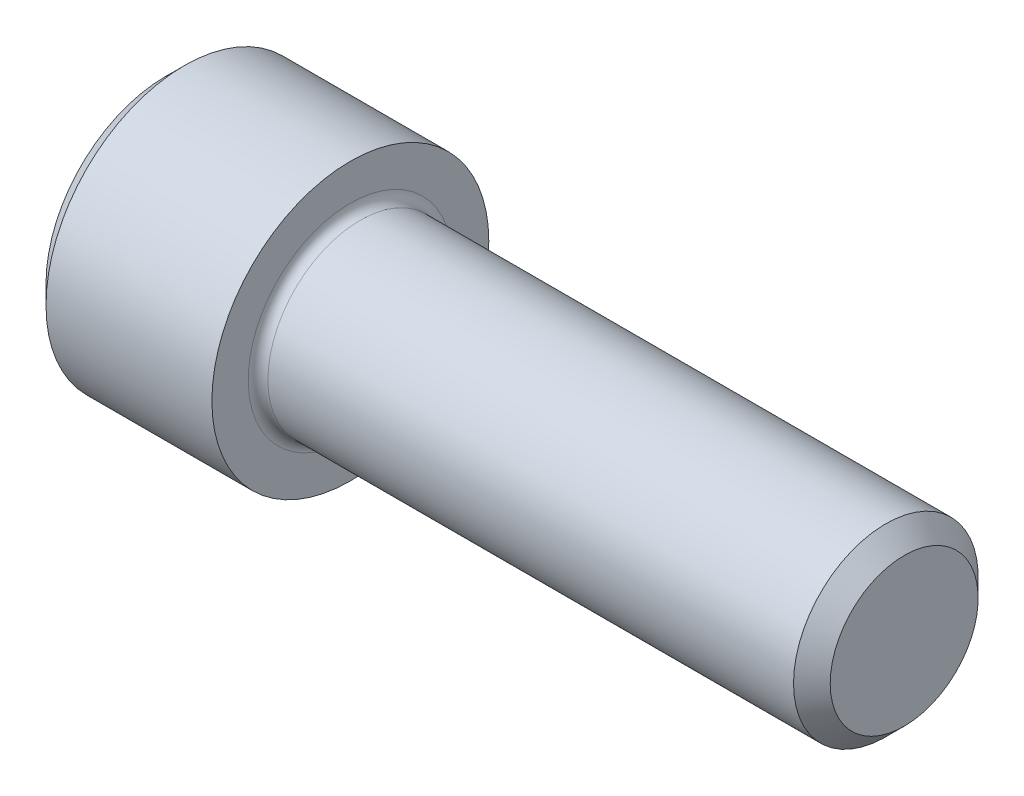
ISO-10303-21;
HEADER;
FILE_DESCRIPTION(('STEP AP214'),'2;1');
FILE_NAME('part.step','',(''),(''),'','','');
FILE_SCHEMA(('AUTOMOTIVE_DESIGN { 1 0 10303 214 1 1 1 1 }'));
ENDSEC;
DATA;
#1=APPLICATION_CONTEXT('core data for automotive mechanical design processes');
#2=APPLICATION_PROTOCOL_DEFINITION('international standard','automotive_design',2000,#1);
#3=PRODUCT_CONTEXT('',#1,'mechanical');
#4=PRODUCT('Part','Part','',(#3));
#5=PRODUCT_RELATED_PRODUCT_CATEGORY('part','',(#4));
#6=PRODUCT_DEFINITION_FORMATION('','',#4);
#7=PRODUCT_DEFINITION_CONTEXT('part definition',#1,'design');
#8=PRODUCT_DEFINITION('design','',#6,#7);
#9=PRODUCT_DEFINITION_SHAPE('','',#8);
#10=(LENGTH_UNIT() NAMED_UNIT(*) SI_UNIT(.MILLI.,.METRE.));
#11=(NAMED_UNIT(*) PLANE_ANGLE_UNIT() SI_UNIT($,.RADIAN.));
#12=(NAMED_UNIT(*) SI_UNIT($,.STERADIAN.) SOLID_ANGLE_UNIT());
#13=UNCERTAINTY_MEASURE_WITH_UNIT(LENGTH_MEASURE(1.E-05),#10,'distance_accuracy_value','');
#14=(GEOMETRIC_REPRESENTATION_CONTEXT(3) GLOBAL_UNCERTAINTY_ASSIGNED_CONTEXT((#13)) GLOBAL_UNIT_ASSIGNED_CONTEXT((#10,
#11,#12)) REPRESENTATION_CONTEXT('',''));
#15=CARTESIAN_POINT('',(0.,0.,0.));
#16=DIRECTION('',(0.,0.,1.));
#17=DIRECTION('',(1.,0.,0.));
#18=AXIS2_PLACEMENT_3D('',#15,#16,#17);
#19=CARTESIAN_POINT('',(0.,0.,0.));
#20=DIRECTION('',(-1.,0.,0.));
#21=DIRECTION('',(0.,0.,1.));
#22=AXIS2_PLACEMENT_3D('',#19,#20,#21);
#23=PLANE('',#22);
#24=DIRECTION('',(0.,-0.5,0.866025403784438));
#25=VECTOR('',#24,1.);
#26=CARTESIAN_POINT('',(0.,4.58271776169267,0.));
#27=LINE('',#26,#25);
#28=CARTESIAN_POINT('',(0.,4.58271776169267,0.));
#29=VERTEX_POINT('',#28);
#30=CARTESIAN_POINT('',(0.,2.29135888084633,3.96875000000013));
#31=VERTEX_POINT('',#30);
#32=EDGE_CURVE('E269',#29,#31,#27,.T.);
#33=ORIENTED_EDGE('',*,*,#32,.T.);
#34=DIRECTION('',(0.,1.,0.));
#35=VECTOR('',#34,1.);
#36=CARTESIAN_POINT('',(0.,-2.29135888084633,3.96875000000008));
#37=LINE('',#36,#35);
#38=CARTESIAN_POINT('',(0.,-2.29135888084633,3.96875000000008));
#39=VERTEX_POINT('',#38);
#40=EDGE_CURVE('E140',#39,#31,#37,.T.);
#41=ORIENTED_EDGE('',*,*,#40,.F.);
#42=DIRECTION('',(0.,-0.500000000000001,-0.866025403784438));
#43=VECTOR('',#42,1.);
#44=CARTESIAN_POINT('',(0.,-2.29135888084633,3.96875000000008));
#45=LINE('',#44,#43);
#46=CARTESIAN_POINT('',(0.,-4.58271776169265,0.));
#47=VERTEX_POINT('',#46);
#48=EDGE_CURVE('E272',#39,#47,#45,.T.);
#49=ORIENTED_EDGE('',*,*,#48,.T.);
#50=DIRECTION('',(0.,0.5,-0.866025403784438));
#51=VECTOR('',#50,1.);
#52=CARTESIAN_POINT('',(0.,-4.58271776169265,0.));
#53=LINE('',#52,#51);
#54=CARTESIAN_POINT('',(0.,-2.29135888084629,-3.96874999999991));
#55=VERTEX_POINT('',#54);
#56=EDGE_CURVE('E275',#47,#55,#53,.T.);
#57=ORIENTED_EDGE('',*,*,#56,.T.);
#58=DIRECTION('',(0.,-1.,0.));
#59=VECTOR('',#58,1.);
#60=CARTESIAN_POINT('',(0.,2.29135888084629,-3.96874999999997));
#61=LINE('',#60,#59);
#62=CARTESIAN_POINT('',(0.,2.29135888084629,-3.96874999999997));
#63=VERTEX_POINT('',#62);
#64=EDGE_CURVE('E278',#63,#55,#61,.T.);
#65=ORIENTED_EDGE('',*,*,#64,.F.);
#66=DIRECTION('',(0.,-0.500000000000001,-0.866025403784437));
#67=VECTOR('',#66,1.);
#68=CARTESIAN_POINT('',(0.,4.58271776169267,0.));
#69=LINE('',#68,#67);
#70=EDGE_CURVE('E135',#29,#63,#69,.T.);
#71=ORIENTED_EDGE('',*,*,#70,.F.);
#72=EDGE_LOOP('',(#33,#41,#49,#57,#65,#71));
#73=FACE_BOUND('',#72,.T.);
#74=CARTESIAN_POINT('',(0.,0.,0.));
#75=DIRECTION('',(-1.,0.,0.));
#76=DIRECTION('',(0.,0.,1.));
#77=AXIS2_PLACEMENT_3D('',#74,#75,#76);
#78=CIRCLE('',#77,6.17855);
#79=CARTESIAN_POINT('',(0.,0.,6.17855));
#80=VERTEX_POINT('',#79);
#81=EDGE_CURVE('E164',#80,#80,#78,.T.);
#82=ORIENTED_EDGE('',*,*,#81,.T.);
#83=EDGE_LOOP('',(#82));
#84=FACE_BOUND('',#83,.T.);
#85=ADVANCED_FACE('F44',(#73,#84),#23,.T.);
#86=CARTESIAN_POINT('',(0.,0.,0.));
#87=DIRECTION('',(1.,0.,0.));
#88=DIRECTION('',(0.,0.,-1.));
#89=AXIS2_PLACEMENT_3D('',#86,#87,#88);
#90=CONICAL_SURFACE('',#89,6.17855,0.785398163397447);
#91=CARTESIAN_POINT('',(0.965199999999999,0.,0.));
#92=DIRECTION('',(-1.,0.,0.));
#93=DIRECTION('',(0.,0.,1.));
#94=AXIS2_PLACEMENT_3D('',#91,#92,#93);
#95=CIRCLE('',#94,7.14375);
#96=CARTESIAN_POINT('',(0.965199999999999,0.,7.14375));
#97=VERTEX_POINT('',#96);
#98=EDGE_CURVE('E161',#97,#97,#95,.T.);
#99=ORIENTED_EDGE('',*,*,#98,.T.);
#100=EDGE_LOOP('',(#99));
#101=FACE_BOUND('',#100,.T.);
#102=ORIENTED_EDGE('',*,*,#81,.F.);
#103=EDGE_LOOP('',(#102));
#104=FACE_BOUND('',#103,.T.);
#105=ADVANCED_FACE('F185',(#101,#104),#90,.T.);
#106=CARTESIAN_POINT('',(-31.75,0.,0.));
#107=DIRECTION('',(-1.,0.,0.));
#108=DIRECTION('',(0.,0.,1.));
#109=AXIS2_PLACEMENT_3D('',#106,#107,#108);
#110=CYLINDRICAL_SURFACE('',#109,7.14375);
#111=CARTESIAN_POINT('',(9.525,0.,0.));
#112=DIRECTION('',(-1.,0.,0.));
#113=DIRECTION('',(0.,0.,1.));
#114=AXIS2_PLACEMENT_3D('',#111,#112,#113);
#115=CIRCLE('',#114,7.14375);
#116=CARTESIAN_POINT('',(9.525,0.,7.14375));
#117=VERTEX_POINT('',#116);
#118=EDGE_CURVE('E158',#117,#117,#115,.T.);
#119=ORIENTED_EDGE('',*,*,#118,.T.);
#120=EDGE_LOOP('',(#119));
#121=FACE_BOUND('',#120,.T.);
#122=ORIENTED_EDGE('',*,*,#98,.F.);
#123=EDGE_LOOP('',(#122));
#124=FACE_BOUND('',#123,.T.);
#125=ADVANCED_FACE('F190',(#121,#124),#110,.T.);
#126=CARTESIAN_POINT('',(9.52500000000001,7.14374999999998,1.11022302462516E-13));
#127=DIRECTION('',(1.,0.,0.));
#128=DIRECTION('',(0.,0.,-1.));
#129=AXIS2_PLACEMENT_3D('',#126,#127,#128);
#130=PLANE('',#129);
#131=CARTESIAN_POINT('',(9.525,0.,0.));
#132=DIRECTION('',(1.,0.,0.));
#133=DIRECTION('',(0.,0.,-1.));
#134=AXIS2_PLACEMENT_3D('',#131,#132,#133);
#135=CIRCLE('',#134,5.2705);
#136=CARTESIAN_POINT('',(9.525,0.,-5.27049999999999));
#137=VERTEX_POINT('',#136);
#138=EDGE_CURVE('E52',#137,#137,#135,.F.);
#139=ORIENTED_EDGE('',*,*,#138,.T.);
#140=EDGE_LOOP('',(#139));
#141=FACE_BOUND('',#140,.T.);
#142=ORIENTED_EDGE('',*,*,#118,.F.);
#143=EDGE_LOOP('',(#142));
#144=FACE_BOUND('',#143,.T.);
#145=ADVANCED_FACE('F169',(#141,#144),#130,.T.);
#146=CARTESIAN_POINT('',(-31.75,0.,0.));
#147=DIRECTION('',(-1.,0.,0.));
#148=DIRECTION('',(0.,0.,1.));
#149=AXIS2_PLACEMENT_3D('',#146,#147,#148);
#150=CYLINDRICAL_SURFACE('',#149,4.7625);
#151=CARTESIAN_POINT('',(10.033,0.,0.));
#152=DIRECTION('',(1.,0.,0.));
#153=DIRECTION('',(0.,0.,-1.));
#154=AXIS2_PLACEMENT_3D('',#151,#152,#153);
#155=CIRCLE('',#154,4.7625);
#156=CARTESIAN_POINT('',(10.033,0.,-4.76249999999999));
#157=VERTEX_POINT('',#156);
#158=EDGE_CURVE('E13',#157,#157,#155,.T.);
#159=ORIENTED_EDGE('',*,*,#158,.T.);
#160=EDGE_LOOP('',(#159));
#161=FACE_BOUND('',#160,.T.);
#162=CARTESIAN_POINT('',(37.15385,0.,0.));
#163=DIRECTION('',(-1.,0.,0.));
#164=DIRECTION('',(0.,0.,1.));
#165=AXIS2_PLACEMENT_3D('',#162,#163,#164);
#166=CIRCLE('',#165,4.76249999999999);
#167=CARTESIAN_POINT('',(37.15385,0.,4.76249999999999));
#168=VERTEX_POINT('',#167);
#169=EDGE_CURVE('E155',#168,#168,#166,.T.);
#170=ORIENTED_EDGE('',*,*,#169,.T.);
#171=EDGE_LOOP('',(#170));
#172=FACE_BOUND('',#171,.T.);
#173=ADVANCED_FACE('F200',(#161,#172),#150,.T.);
#174=CARTESIAN_POINT('',(38.1,0.,0.));
#175=DIRECTION('',(-1.,0.,0.));
#176=DIRECTION('',(0.,0.,1.));
#177=AXIS2_PLACEMENT_3D('',#174,#175,#176);
#178=CONICAL_SURFACE('',#177,3.81635,0.78539816339744);
#179=ORIENTED_EDGE('',*,*,#169,.F.);
#180=EDGE_LOOP('',(#179));
#181=FACE_BOUND('',#180,.T.);
#182=CARTESIAN_POINT('',(38.1,0.,0.));
#183=DIRECTION('',(-1.,0.,0.));
#184=DIRECTION('',(0.,0.,1.));
#185=AXIS2_PLACEMENT_3D('',#182,#183,#184);
#186=CIRCLE('',#185,3.81635);
#187=CARTESIAN_POINT('',(38.1,0.,3.81635));
#188=VERTEX_POINT('',#187);
#189=EDGE_CURVE('E151',#188,#188,#186,.T.);
#190=ORIENTED_EDGE('',*,*,#189,.T.);
#191=EDGE_LOOP('',(#190));
#192=FACE_BOUND('',#191,.T.);
#193=ADVANCED_FACE('F180',(#181,#192),#178,.T.);
#194=CARTESIAN_POINT('',(38.1,3.81634999999997,0.));
#195=DIRECTION('',(1.,0.,0.));
#196=DIRECTION('',(0.,0.,-1.));
#197=AXIS2_PLACEMENT_3D('',#194,#195,#196);
#198=PLANE('',#197);
#199=ORIENTED_EDGE('',*,*,#189,.F.);
#200=EDGE_LOOP('',(#199));
#201=FACE_BOUND('',#200,.T.);
#202=ADVANCED_FACE('F173',(#201),#198,.T.);
#203=CARTESIAN_POINT('',(10.033,0.,0.));
#204=DIRECTION('',(1.,0.,0.));
#205=DIRECTION('',(0.,0.,-1.));
#206=AXIS2_PLACEMENT_3D('',#203,#204,#205);
#207=TOROIDAL_SURFACE('',#206,5.2705,0.508);
#208=ORIENTED_EDGE('',*,*,#158,.F.);
#209=EDGE_LOOP('',(#208));
#210=FACE_BOUND('',#209,.T.);
#211=ORIENTED_EDGE('',*,*,#138,.F.);
#212=EDGE_LOOP('',(#211));
#213=FACE_BOUND('',#212,.T.);
#214=ADVANCED_FACE('F46',(#210,#213),#207,.F.);
#215=CARTESIAN_POINT('',(4.6228,4.58271776169265,0.));
#216=DIRECTION('',(0.,-0.866025403784438,-0.5));
#217=DIRECTION('',(0.,0.5,-0.866025403784438));
#218=AXIS2_PLACEMENT_3D('',#215,#216,#217);
#219=PLANE('',#218);
#220=ORIENTED_EDGE('',*,*,#32,.F.);
#221=DIRECTION('',(-1.,0.,0.));
#222=VECTOR('',#221,1.);
#223=CARTESIAN_POINT('',(4.6228,4.58271776169265,0.));
#224=LINE('',#223,#222);
#225=CARTESIAN_POINT('',(4.6228,4.58271776169265,0.));
#226=VERTEX_POINT('',#225);
#227=EDGE_CURVE('E259',#226,#29,#224,.T.);
#228=ORIENTED_EDGE('',*,*,#227,.F.);
#229=DIRECTION('',(0.,-0.5,0.866025403784438));
#230=VECTOR('',#229,1.);
#231=CARTESIAN_POINT('',(4.6228,4.58271776169265,0.));
#232=LINE('',#231,#230);
#233=CARTESIAN_POINT('',(4.62280000000001,3.4370383212695,1.98437500000004));
#234=VERTEX_POINT('',#233);
#235=EDGE_CURVE('E127',#226,#234,#232,.T.);
#236=ORIENTED_EDGE('',*,*,#235,.T.);
#237=CARTESIAN_POINT('',(4.6228,2.29135888084632,3.96875000000013));
#238=VERTEX_POINT('',#237);
#239=EDGE_CURVE('E118',#234,#238,#232,.T.);
#240=ORIENTED_EDGE('',*,*,#239,.T.);
#241=DIRECTION('',(-1.,0.,0.));
#242=VECTOR('',#241,1.);
#243=CARTESIAN_POINT('',(4.6228,2.29135888084632,3.96875000000013));
#244=LINE('',#243,#242);
#245=EDGE_CURVE('E132',#238,#31,#244,.T.);
#246=ORIENTED_EDGE('',*,*,#245,.T.);
#247=EDGE_LOOP('',(#220,#228,#236,#240,#246));
#248=FACE_BOUND('',#247,.T.);
#249=ADVANCED_FACE('F131',(#248),#219,.T.);
#250=CARTESIAN_POINT('',(4.6228,-2.29135888084635,3.96875000000008));
#251=DIRECTION('',(0.,0.,1.));
#252=DIRECTION('',(0.,-1.,0.));
#253=AXIS2_PLACEMENT_3D('',#250,#251,#252);
#254=PLANE('',#253);
#255=ORIENTED_EDGE('',*,*,#40,.T.);
#256=ORIENTED_EDGE('',*,*,#245,.F.);
#257=DIRECTION('',(0.,1.,0.));
#258=VECTOR('',#257,1.);
#259=CARTESIAN_POINT('',(4.6228,-2.29135888084635,3.96875000000008));
#260=LINE('',#259,#258);
#261=CARTESIAN_POINT('',(4.6228,0.,3.96875000000013));
#262=VERTEX_POINT('',#261);
#263=EDGE_CURVE('E115',#262,#238,#260,.T.);
#264=ORIENTED_EDGE('',*,*,#263,.F.);
#265=CARTESIAN_POINT('',(4.6228,-2.29135888084635,3.96875000000008));
#266=VERTEX_POINT('',#265);
#267=EDGE_CURVE('E126',#266,#262,#260,.T.);
#268=ORIENTED_EDGE('',*,*,#267,.F.);
#269=DIRECTION('',(-1.,0.,0.));
#270=VECTOR('',#269,1.);
#271=CARTESIAN_POINT('',(4.6228,-2.29135888084635,3.96875000000008));
#272=LINE('',#271,#270);
#273=EDGE_CURVE('E142',#266,#39,#272,.T.);
#274=ORIENTED_EDGE('',*,*,#273,.T.);
#275=EDGE_LOOP('',(#255,#256,#264,#268,#274));
#276=FACE_BOUND('',#275,.T.);
#277=ADVANCED_FACE('F137',(#276),#254,.F.);
#278=CARTESIAN_POINT('',(4.6228,-2.29135888084635,3.96875000000008));
#279=DIRECTION('',(0.,0.866025403784438,-0.500000000000001));
#280=DIRECTION('',(0.,0.500000000000001,0.866025403784438));
#281=AXIS2_PLACEMENT_3D('',#278,#279,#280);
#282=PLANE('',#281);
#283=ORIENTED_EDGE('',*,*,#48,.F.);
#284=ORIENTED_EDGE('',*,*,#273,.F.);
#285=DIRECTION('',(0.,-0.500000000000001,-0.866025403784438));
#286=VECTOR('',#285,1.);
#287=CARTESIAN_POINT('',(4.6228,-2.29135888084635,3.96875000000008));
#288=LINE('',#287,#286);
#289=CARTESIAN_POINT('',(4.6228,-3.43703832126951,1.98437500000009));
#290=VERTEX_POINT('',#289);
#291=EDGE_CURVE('E298',#266,#290,#288,.T.);
#292=ORIENTED_EDGE('',*,*,#291,.T.);
#293=CARTESIAN_POINT('',(4.6228,-4.58271776169267,0.));
#294=VERTEX_POINT('',#293);
#295=EDGE_CURVE('E287',#290,#294,#288,.T.);
#296=ORIENTED_EDGE('',*,*,#295,.T.);
#297=DIRECTION('',(-1.,0.,0.));
#298=VECTOR('',#297,1.);
#299=CARTESIAN_POINT('',(4.6228,-4.58271776169267,0.));
#300=LINE('',#299,#298);
#301=EDGE_CURVE('E147',#294,#47,#300,.T.);
#302=ORIENTED_EDGE('',*,*,#301,.T.);
#303=EDGE_LOOP('',(#283,#284,#292,#296,#302));
#304=FACE_BOUND('',#303,.T.);
#305=ADVANCED_FACE('F213',(#304),#282,.T.);
#306=CARTESIAN_POINT('',(4.6228,-4.58271776169267,0.));
#307=DIRECTION('',(0.,0.866025403784438,0.5));
#308=DIRECTION('',(0.,-0.5,0.866025403784438));
#309=AXIS2_PLACEMENT_3D('',#306,#307,#308);
#310=PLANE('',#309);
#311=ORIENTED_EDGE('',*,*,#56,.F.);
#312=ORIENTED_EDGE('',*,*,#301,.F.);
#313=DIRECTION('',(0.,0.5,-0.866025403784438));
#314=VECTOR('',#313,1.);
#315=CARTESIAN_POINT('',(4.6228,-4.58271776169267,0.));
#316=LINE('',#315,#314);
#317=CARTESIAN_POINT('',(4.6228,-3.4370383212695,-1.98437499999993));
#318=VERTEX_POINT('',#317);
#319=EDGE_CURVE('E265',#294,#318,#316,.T.);
#320=ORIENTED_EDGE('',*,*,#319,.T.);
#321=CARTESIAN_POINT('',(4.6228,-2.29135888084631,-3.96874999999991));
#322=VERTEX_POINT('',#321);
#323=EDGE_CURVE('E297',#318,#322,#316,.T.);
#324=ORIENTED_EDGE('',*,*,#323,.T.);
#325=DIRECTION('',(-1.,0.,0.));
#326=VECTOR('',#325,1.);
#327=CARTESIAN_POINT('',(4.6228,-2.29135888084631,-3.96874999999991));
#328=LINE('',#327,#326);
#329=EDGE_CURVE('E258',#322,#55,#328,.T.);
#330=ORIENTED_EDGE('',*,*,#329,.T.);
#331=EDGE_LOOP('',(#311,#312,#320,#324,#330));
#332=FACE_BOUND('',#331,.T.);
#333=ADVANCED_FACE('F216',(#332),#310,.T.);
#334=CARTESIAN_POINT('',(4.6228,2.29135888084631,-3.96874999999991));
#335=DIRECTION('',(0.,0.,-1.));
#336=DIRECTION('',(0.,1.,0.));
#337=AXIS2_PLACEMENT_3D('',#334,#335,#336);
#338=PLANE('',#337);
#339=ORIENTED_EDGE('',*,*,#64,.T.);
#340=ORIENTED_EDGE('',*,*,#329,.F.);
#341=DIRECTION('',(0.,-1.,0.));
#342=VECTOR('',#341,1.);
#343=CARTESIAN_POINT('',(4.6228,2.29135888084631,-3.96874999999991));
#344=LINE('',#343,#342);
#345=CARTESIAN_POINT('',(4.6228,0.,-3.96874999999991));
#346=VERTEX_POINT('',#345);
#347=EDGE_CURVE('E262',#346,#322,#344,.T.);
#348=ORIENTED_EDGE('',*,*,#347,.F.);
#349=CARTESIAN_POINT('',(4.6228,2.29135888084631,-3.96874999999991));
#350=VERTEX_POINT('',#349);
#351=EDGE_CURVE('E59',#350,#346,#344,.T.);
#352=ORIENTED_EDGE('',*,*,#351,.F.);
#353=DIRECTION('',(-1.,0.,0.));
#354=VECTOR('',#353,1.);
#355=CARTESIAN_POINT('',(4.6228,2.29135888084631,-3.96874999999991));
#356=LINE('',#355,#354);
#357=EDGE_CURVE('E255',#350,#63,#356,.T.);
#358=ORIENTED_EDGE('',*,*,#357,.T.);
#359=EDGE_LOOP('',(#339,#340,#348,#352,#358));
#360=FACE_BOUND('',#359,.T.);
#361=ADVANCED_FACE('F220',(#360),#338,.F.);
#362=CARTESIAN_POINT('',(4.6228,4.58271776169265,0.));
#363=DIRECTION('',(0.,0.866025403784437,-0.500000000000001));
#364=DIRECTION('',(0.,0.500000000000001,0.866025403784438));
#365=AXIS2_PLACEMENT_3D('',#362,#363,#364);
#366=PLANE('',#365);
#367=ORIENTED_EDGE('',*,*,#70,.T.);
#368=ORIENTED_EDGE('',*,*,#357,.F.);
#369=DIRECTION('',(0.,-0.500000000000001,-0.866025403784437));
#370=VECTOR('',#369,1.);
#371=CARTESIAN_POINT('',(4.6228,4.58271776169265,0.));
#372=LINE('',#371,#370);
#373=CARTESIAN_POINT('',(4.62280000000001,3.43703832126946,-1.98437499999998));
#374=VERTEX_POINT('',#373);
#375=EDGE_CURVE('E245',#374,#350,#372,.T.);
#376=ORIENTED_EDGE('',*,*,#375,.F.);
#377=EDGE_CURVE('E251',#226,#374,#372,.T.);
#378=ORIENTED_EDGE('',*,*,#377,.F.);
#379=ORIENTED_EDGE('',*,*,#227,.T.);
#380=EDGE_LOOP('',(#367,#368,#376,#378,#379));
#381=FACE_BOUND('',#380,.T.);
#382=ADVANCED_FACE('F224',(#381),#366,.F.);
#383=CARTESIAN_POINT('',(4.6228,4.58271776169265,0.));
#384=DIRECTION('',(1.,0.,0.));
#385=DIRECTION('',(0.,0.,-1.));
#386=AXIS2_PLACEMENT_3D('',#383,#384,#385);
#387=PLANE('',#386);
#388=ORIENTED_EDGE('',*,*,#347,.T.);
#389=ORIENTED_EDGE('',*,*,#323,.F.);
#390=CARTESIAN_POINT('',(4.6228,0.,0.));
#391=DIRECTION('',(-1.,0.,0.));
#392=DIRECTION('',(0.,0.,1.));
#393=AXIS2_PLACEMENT_3D('',#390,#391,#392);
#394=CIRCLE('',#393,3.96875);
#395=EDGE_CURVE('E293',#346,#318,#394,.T.);
#396=ORIENTED_EDGE('',*,*,#395,.F.);
#397=EDGE_LOOP('',(#388,#389,#396));
#398=FACE_BOUND('',#397,.T.);
#399=ADVANCED_FACE('F228',(#398),#387,.F.);
#400=ORIENTED_EDGE('',*,*,#319,.F.);
#401=ORIENTED_EDGE('',*,*,#295,.F.);
#402=EDGE_CURVE('E145',#318,#290,#394,.T.);
#403=ORIENTED_EDGE('',*,*,#402,.F.);
#404=EDGE_LOOP('',(#400,#401,#403));
#405=FACE_BOUND('',#404,.T.);
#406=ADVANCED_FACE('F231',(#405),#387,.F.);
#407=ORIENTED_EDGE('',*,*,#291,.F.);
#408=ORIENTED_EDGE('',*,*,#267,.T.);
#409=EDGE_CURVE('E141',#290,#262,#394,.T.);
#410=ORIENTED_EDGE('',*,*,#409,.F.);
#411=EDGE_LOOP('',(#407,#408,#410));
#412=FACE_BOUND('',#411,.T.);
#413=ADVANCED_FACE('F236',(#412),#387,.F.);
#414=ORIENTED_EDGE('',*,*,#263,.T.);
#415=ORIENTED_EDGE('',*,*,#239,.F.);
#416=EDGE_CURVE('E121',#262,#234,#394,.T.);
#417=ORIENTED_EDGE('',*,*,#416,.F.);
#418=EDGE_LOOP('',(#414,#415,#417));
#419=FACE_BOUND('',#418,.T.);
#420=ADVANCED_FACE('F117',(#419),#387,.F.);
#421=ORIENTED_EDGE('',*,*,#235,.F.);
#422=ORIENTED_EDGE('',*,*,#377,.T.);
#423=EDGE_CURVE('E152',#234,#374,#394,.T.);
#424=ORIENTED_EDGE('',*,*,#423,.F.);
#425=EDGE_LOOP('',(#421,#422,#424));
#426=FACE_BOUND('',#425,.T.);
#427=ADVANCED_FACE('F239',(#426),#387,.F.);
#428=ORIENTED_EDGE('',*,*,#375,.T.);
#429=ORIENTED_EDGE('',*,*,#351,.T.);
#430=EDGE_CURVE('E248',#374,#346,#394,.T.);
#431=ORIENTED_EDGE('',*,*,#430,.F.);
#432=EDGE_LOOP('',(#428,#429,#431));
#433=FACE_BOUND('',#432,.T.);
#434=ADVANCED_FACE('F209',(#433),#387,.F.);
#435=CARTESIAN_POINT('',(4.6228,0.,0.));
#436=DIRECTION('',(-1.,0.,0.));
#437=DIRECTION('',(0.,0.,1.));
#438=AXIS2_PLACEMENT_3D('',#435,#436,#437);
#439=CONICAL_SURFACE('',#438,3.96875,1.04719755119659);
#440=CARTESIAN_POINT('',(6.91415888084634,0.,0.));
#441=VERTEX_POINT('',#440);
#442=VERTEX_LOOP('',#441);
#443=FACE_BOUND('',#442,.T.);
#444=ORIENTED_EDGE('',*,*,#416,.T.);
#445=ORIENTED_EDGE('',*,*,#423,.T.);
#446=ORIENTED_EDGE('',*,*,#430,.T.);
#447=ORIENTED_EDGE('',*,*,#395,.T.);
#448=ORIENTED_EDGE('',*,*,#402,.T.);
#449=ORIENTED_EDGE('',*,*,#409,.T.);
#450=EDGE_LOOP('',(#444,#445,#446,#447,#448,#449));
#451=FACE_BOUND('',#450,.T.);
#452=ADVANCED_FACE('F207',(#443,#451),#439,.F.);
#453=CLOSED_SHELL('',(#85,#105,#125,#145,#173,#193,#202,#214,#249,#277,#305,#333,#361,#382,#399,
#406,#413,#420,#427,#434,#452));
#454=MANIFOLD_SOLID_BREP('B2',#453);
#455=ADVANCED_BREP_SHAPE_REPRESENTATION('',(#18,#454),#14);
#456=SHAPE_DEFINITION_REPRESENTATION(#9,#455);
ENDSEC;
END-ISO-10303-21;
